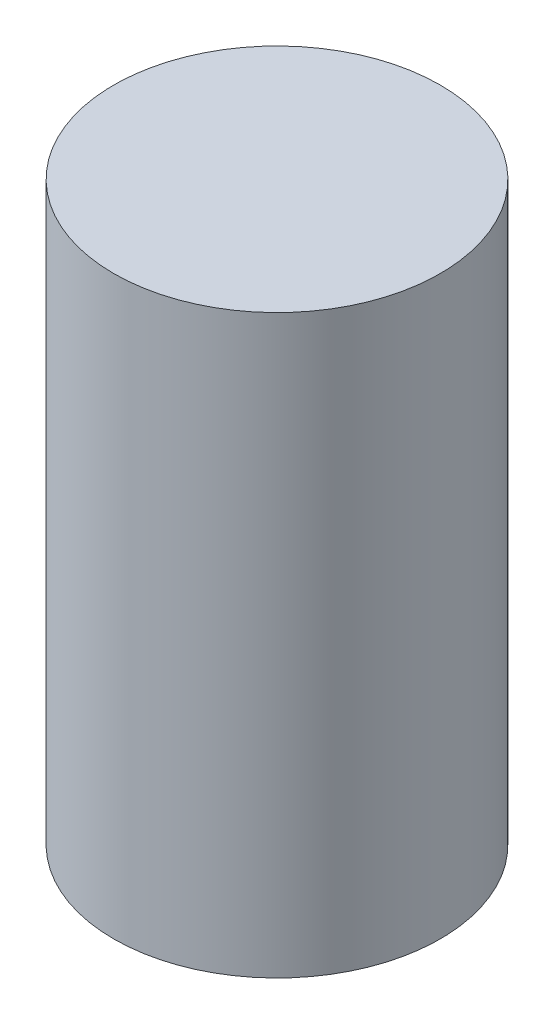
ISO-10303-21;
HEADER;
FILE_DESCRIPTION(('STEP AP214'),'2;1');
FILE_NAME('part.step','',(''),(''),'','','');
FILE_SCHEMA(('AUTOMOTIVE_DESIGN { 1 0 10303 214 1 1 1 1 }'));
ENDSEC;
DATA;
#1=APPLICATION_CONTEXT('core data for automotive mechanical design processes');
#2=APPLICATION_PROTOCOL_DEFINITION('international standard','automotive_design',2000,#1);
#3=PRODUCT_CONTEXT('',#1,'mechanical');
#4=PRODUCT('Part','Part','',(#3));
#5=PRODUCT_RELATED_PRODUCT_CATEGORY('part','',(#4));
#6=PRODUCT_DEFINITION_FORMATION('','',#4);
#7=PRODUCT_DEFINITION_CONTEXT('part definition',#1,'design');
#8=PRODUCT_DEFINITION('design','',#6,#7);
#9=PRODUCT_DEFINITION_SHAPE('','',#8);
#10=(LENGTH_UNIT() NAMED_UNIT(*) SI_UNIT(.MILLI.,.METRE.));
#11=(NAMED_UNIT(*) PLANE_ANGLE_UNIT() SI_UNIT($,.RADIAN.));
#12=(NAMED_UNIT(*) SI_UNIT($,.STERADIAN.) SOLID_ANGLE_UNIT());
#13=UNCERTAINTY_MEASURE_WITH_UNIT(LENGTH_MEASURE(1.E-05),#10,'distance_accuracy_value','');
#14=(GEOMETRIC_REPRESENTATION_CONTEXT(3) GLOBAL_UNCERTAINTY_ASSIGNED_CONTEXT((#13)) GLOBAL_UNIT_ASSIGNED_CONTEXT((#10,
#11,#12)) REPRESENTATION_CONTEXT('',''));
#15=CARTESIAN_POINT('',(0.,0.,0.));
#16=DIRECTION('',(0.,0.,1.));
#17=DIRECTION('',(1.,0.,0.));
#18=AXIS2_PLACEMENT_3D('',#15,#16,#17);
#19=CARTESIAN_POINT('',(0.,90.,0.));
#20=DIRECTION('',(0.,-1.,0.));
#21=DIRECTION('',(0.,0.,-1.));
#22=AXIS2_PLACEMENT_3D('',#19,#20,#21);
#23=CYLINDRICAL_SURFACE('',#22,25.5);
#24=CARTESIAN_POINT('',(0.,90.,0.));
#25=DIRECTION('',(0.,1.,0.));
#26=DIRECTION('',(0.,0.,1.));
#27=AXIS2_PLACEMENT_3D('',#24,#25,#26);
#28=CIRCLE('',#27,25.5);
#29=CARTESIAN_POINT('',(0.,90.,-25.5));
#30=VERTEX_POINT('',#29);
#31=EDGE_CURVE('E10',#30,#30,#28,.T.);
#32=CARTESIAN_POINT('',(0.,0.,0.));
#33=DIRECTION('',(0.,1.,0.));
#34=DIRECTION('',(0.,0.,1.));
#35=AXIS2_PLACEMENT_3D('',#32,#33,#34);
#36=CIRCLE('',#35,25.5);
#37=CARTESIAN_POINT('',(0.,0.,-25.5));
#38=VERTEX_POINT('',#37);
#39=EDGE_CURVE('E34',#38,#38,#36,.T.);
#40=CARTESIAN_POINT('',(0.,90.,-25.5));
#41=CARTESIAN_POINT('',(0.,89.0625,-25.5));
#42=CARTESIAN_POINT('',(0.,88.125,-25.5));
#43=CARTESIAN_POINT('',(0.,86.25,-25.5));
#44=CARTESIAN_POINT('',(0.,85.3125,-25.5));
#45=CARTESIAN_POINT('',(0.,83.4375,-25.5));
#46=CARTESIAN_POINT('',(0.,82.5,-25.5));
#47=CARTESIAN_POINT('',(0.,80.625,-25.5));
#48=CARTESIAN_POINT('',(0.,79.6875,-25.5));
#49=CARTESIAN_POINT('',(0.,77.8125,-25.5));
#50=CARTESIAN_POINT('',(0.,76.875,-25.5));
#51=CARTESIAN_POINT('',(0.,75.,-25.5));
#52=CARTESIAN_POINT('',(0.,74.0625,-25.5));
#53=CARTESIAN_POINT('',(0.,72.1875,-25.5));
#54=CARTESIAN_POINT('',(0.,71.25,-25.5));
#55=CARTESIAN_POINT('',(0.,69.375,-25.5));
#56=CARTESIAN_POINT('',(0.,68.4375,-25.5));
#57=CARTESIAN_POINT('',(0.,66.5625,-25.5));
#58=CARTESIAN_POINT('',(0.,65.625,-25.5));
#59=CARTESIAN_POINT('',(0.,63.75,-25.5));
#60=CARTESIAN_POINT('',(0.,62.8125,-25.5));
#61=CARTESIAN_POINT('',(0.,60.9375,-25.5));
#62=CARTESIAN_POINT('',(0.,60.,-25.5));
#63=CARTESIAN_POINT('',(0.,58.125,-25.5));
#64=CARTESIAN_POINT('',(0.,57.1875,-25.5));
#65=CARTESIAN_POINT('',(0.,55.3125,-25.5));
#66=CARTESIAN_POINT('',(0.,54.375,-25.5));
#67=CARTESIAN_POINT('',(0.,52.5,-25.5));
#68=CARTESIAN_POINT('',(0.,51.5625,-25.5));
#69=CARTESIAN_POINT('',(0.,49.6875,-25.5));
#70=CARTESIAN_POINT('',(0.,48.75,-25.5));
#71=CARTESIAN_POINT('',(0.,46.875,-25.5));
#72=CARTESIAN_POINT('',(0.,45.9375,-25.5));
#73=CARTESIAN_POINT('',(0.,44.0625,-25.5));
#74=CARTESIAN_POINT('',(0.,43.125,-25.5));
#75=CARTESIAN_POINT('',(0.,41.25,-25.5));
#76=CARTESIAN_POINT('',(0.,40.3125,-25.5));
#77=CARTESIAN_POINT('',(0.,38.4375,-25.5));
#78=CARTESIAN_POINT('',(0.,37.5,-25.5));
#79=CARTESIAN_POINT('',(0.,35.625,-25.5));
#80=CARTESIAN_POINT('',(0.,34.6875,-25.5));
#81=CARTESIAN_POINT('',(0.,32.8125,-25.5));
#82=CARTESIAN_POINT('',(0.,31.875,-25.5));
#83=CARTESIAN_POINT('',(0.,30.,-25.5));
#84=CARTESIAN_POINT('',(0.,29.0625,-25.5));
#85=CARTESIAN_POINT('',(0.,27.1875,-25.5));
#86=CARTESIAN_POINT('',(0.,26.25,-25.5));
#87=CARTESIAN_POINT('',(0.,24.375,-25.5));
#88=CARTESIAN_POINT('',(0.,23.4375,-25.5));
#89=CARTESIAN_POINT('',(0.,21.5625,-25.5));
#90=CARTESIAN_POINT('',(0.,20.625,-25.5));
#91=CARTESIAN_POINT('',(0.,18.75,-25.5));
#92=CARTESIAN_POINT('',(0.,17.8125,-25.5));
#93=CARTESIAN_POINT('',(0.,15.9375,-25.5));
#94=CARTESIAN_POINT('',(0.,15.,-25.5));
#95=CARTESIAN_POINT('',(0.,13.125,-25.5));
#96=CARTESIAN_POINT('',(0.,12.1875,-25.5));
#97=CARTESIAN_POINT('',(0.,10.3125,-25.5));
#98=CARTESIAN_POINT('',(0.,9.37499999999999,-25.5));
#99=CARTESIAN_POINT('',(0.,7.49999999999999,-25.5));
#100=CARTESIAN_POINT('',(0.,6.56249999999999,-25.5));
#101=CARTESIAN_POINT('',(0.,4.68749999999999,-25.5));
#102=CARTESIAN_POINT('',(0.,3.74999999999998,-25.5));
#103=CARTESIAN_POINT('',(0.,1.87499999999998,-25.5));
#104=CARTESIAN_POINT('',(0.,0.937499999999986,-25.5));
#105=CARTESIAN_POINT('',(0.,0.,-25.5));
#106=B_SPLINE_CURVE_WITH_KNOTS('',3,(#40,#41,#42,#43,#44,#45,#46,#47,#48,#49,#50,#51,#52,#53,
#54,#55,#56,#57,#58,#59,#60,#61,#62,#63,#64,#65,#66,#67,#68,#69,#70,#71,#72,#73,#74,#75,#76,#77,
#78,#79,#80,#81,#82,#83,#84,#85,#86,#87,#88,#89,#90,#91,#92,#93,#94,#95,#96,#97,#98,#99,#100,
#101,#102,#103,#104,#105),.UNSPECIFIED.,.F.,.F.,(4,2,2,2,2,2,2,2,2,2,2,2,2,2,2,2,2,2,2,2,2,2,2,
2,2,2,2,2,2,2,2,2,4),(0.,2.8125,5.62499999999999,8.43749999999999,11.25,14.0625,16.875,19.6875,
22.5,25.3125,28.125,30.9375,33.75,36.5625,39.375,42.1875,45.,47.8125,50.625,53.4375,56.25,
59.0625,61.875,64.6875,67.5,70.3125,73.125,75.9375,78.75,81.5625,84.375,87.1875,90.),.UNSPECIFIED.);
#107=EDGE_CURVE('BSEAM31',#30,#38,#106,.T.);
#108=ORIENTED_EDGE('',*,*,#31,.F.);
#109=ORIENTED_EDGE('',*,*,#39,.T.);
#110=ORIENTED_EDGE('',*,*,#107,.T.);
#111=ORIENTED_EDGE('',*,*,#107,.F.);
#112=EDGE_LOOP('',(#108,#110,#109,#111));
#113=FACE_BOUND('',#112,.T.);
#114=ADVANCED_FACE('F31',(#113),#23,.T.);
#115=CARTESIAN_POINT('',(0.,90.,0.));
#116=DIRECTION('',(0.,1.,0.));
#117=DIRECTION('',(0.,0.,1.));
#118=AXIS2_PLACEMENT_3D('',#115,#116,#117);
#119=PLANE('',#118);
#120=ORIENTED_EDGE('',*,*,#31,.T.);
#121=EDGE_LOOP('',(#120));
#122=FACE_BOUND('',#121,.T.);
#123=ADVANCED_FACE('F46',(#122),#119,.T.);
#124=CARTESIAN_POINT('',(0.,0.,0.));
#125=DIRECTION('',(0.,1.,0.));
#126=DIRECTION('',(0.,0.,1.));
#127=AXIS2_PLACEMENT_3D('',#124,#125,#126);
#128=PLANE('',#127);
#129=ORIENTED_EDGE('',*,*,#39,.F.);
#130=EDGE_LOOP('',(#129));
#131=FACE_BOUND('',#130,.T.);
#132=ADVANCED_FACE('F44',(#131),#128,.F.);
#133=CLOSED_SHELL('',(#114,#123,#132));
#134=MANIFOLD_SOLID_BREP('B2',#133);
#135=ADVANCED_BREP_SHAPE_REPRESENTATION('',(#18,#134),#14);
#136=SHAPE_DEFINITION_REPRESENTATION(#9,#135);
ENDSEC;
END-ISO-10303-21;
